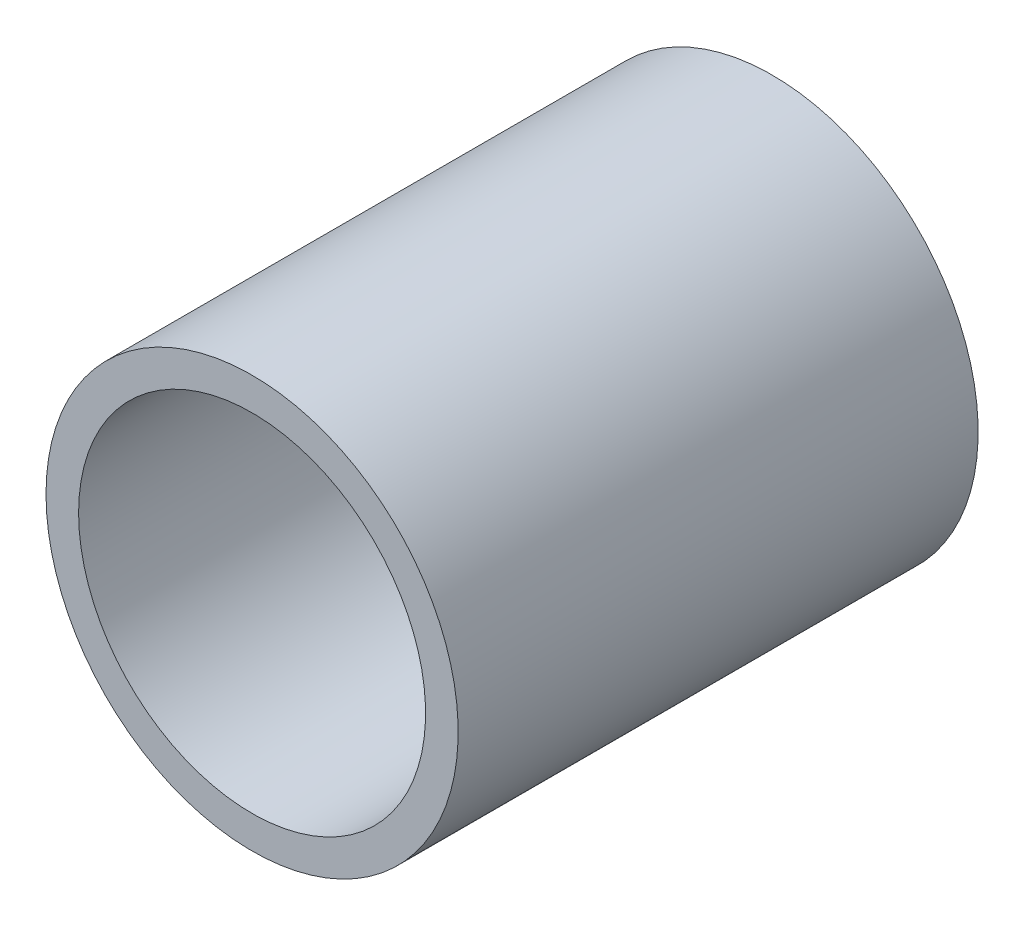
ISO-10303-21;
HEADER;
FILE_DESCRIPTION(('STEP AP214'),'2;1');
FILE_NAME('part.step','',(''),(''),'','','');
FILE_SCHEMA(('AUTOMOTIVE_DESIGN { 1 0 10303 214 1 1 1 1 }'));
ENDSEC;
DATA;
#1=APPLICATION_CONTEXT('core data for automotive mechanical design processes');
#2=APPLICATION_PROTOCOL_DEFINITION('international standard','automotive_design',2000,#1);
#3=PRODUCT_CONTEXT('',#1,'mechanical');
#4=PRODUCT('Part','Part','',(#3));
#5=PRODUCT_RELATED_PRODUCT_CATEGORY('part','',(#4));
#6=PRODUCT_DEFINITION_FORMATION('','',#4);
#7=PRODUCT_DEFINITION_CONTEXT('part definition',#1,'design');
#8=PRODUCT_DEFINITION('design','',#6,#7);
#9=PRODUCT_DEFINITION_SHAPE('','',#8);
#10=(LENGTH_UNIT() NAMED_UNIT(*) SI_UNIT(.MILLI.,.METRE.));
#11=(NAMED_UNIT(*) PLANE_ANGLE_UNIT() SI_UNIT($,.RADIAN.));
#12=(NAMED_UNIT(*) SI_UNIT($,.STERADIAN.) SOLID_ANGLE_UNIT());
#13=UNCERTAINTY_MEASURE_WITH_UNIT(LENGTH_MEASURE(1.E-05),#10,'distance_accuracy_value','');
#14=(GEOMETRIC_REPRESENTATION_CONTEXT(3) GLOBAL_UNCERTAINTY_ASSIGNED_CONTEXT((#13)) GLOBAL_UNIT_ASSIGNED_CONTEXT((#10,
#11,#12)) REPRESENTATION_CONTEXT('',''));
#15=CARTESIAN_POINT('',(0.,0.,0.));
#16=DIRECTION('',(0.,0.,1.));
#17=DIRECTION('',(1.,0.,0.));
#18=AXIS2_PLACEMENT_3D('',#15,#16,#17);
#19=CARTESIAN_POINT('',(15.1003,0.,19.05));
#20=DIRECTION('',(0.,0.,1.));
#21=DIRECTION('',(1.,0.,0.));
#22=AXIS2_PLACEMENT_3D('',#19,#20,#21);
#23=PLANE('',#22);
#24=CARTESIAN_POINT('',(0.,0.,19.05));
#25=DIRECTION('',(0.,0.,-1.));
#26=DIRECTION('',(-1.,0.,0.));
#27=AXIS2_PLACEMENT_3D('',#24,#25,#26);
#28=CIRCLE('',#27,12.7127);
#29=CARTESIAN_POINT('',(-12.7127,0.,19.05));
#30=VERTEX_POINT('',#29);
#31=EDGE_CURVE('E36',#30,#30,#28,.T.);
#32=ORIENTED_EDGE('',*,*,#31,.T.);
#33=EDGE_LOOP('',(#32));
#34=FACE_BOUND('',#33,.T.);
#35=CARTESIAN_POINT('',(0.,0.,19.05));
#36=DIRECTION('',(0.,0.,-1.));
#37=DIRECTION('',(-1.,0.,0.));
#38=AXIS2_PLACEMENT_3D('',#35,#36,#37);
#39=CIRCLE('',#38,15.1003);
#40=CARTESIAN_POINT('',(-15.1003,0.,19.05));
#41=VERTEX_POINT('',#40);
#42=EDGE_CURVE('E22',#41,#41,#39,.T.);
#43=ORIENTED_EDGE('',*,*,#42,.F.);
#44=EDGE_LOOP('',(#43));
#45=FACE_BOUND('',#44,.T.);
#46=ADVANCED_FACE('F15',(#34,#45),#23,.T.);
#47=CARTESIAN_POINT('',(12.7127,0.,-19.05));
#48=DIRECTION('',(0.,0.,-1.));
#49=DIRECTION('',(0.,-1.,0.));
#50=AXIS2_PLACEMENT_3D('',#47,#48,#49);
#51=PLANE('',#50);
#52=CARTESIAN_POINT('',(0.,0.,-19.05));
#53=DIRECTION('',(0.,0.,-1.));
#54=DIRECTION('',(-1.,0.,0.));
#55=AXIS2_PLACEMENT_3D('',#52,#53,#54);
#56=CIRCLE('',#55,12.7127);
#57=CARTESIAN_POINT('',(-12.7127,0.,-19.05));
#58=VERTEX_POINT('',#57);
#59=EDGE_CURVE('E33',#58,#58,#56,.T.);
#60=ORIENTED_EDGE('',*,*,#59,.F.);
#61=EDGE_LOOP('',(#60));
#62=FACE_BOUND('',#61,.T.);
#63=CARTESIAN_POINT('',(0.,0.,-19.05));
#64=DIRECTION('',(0.,0.,-1.));
#65=DIRECTION('',(-1.,0.,0.));
#66=AXIS2_PLACEMENT_3D('',#63,#64,#65);
#67=CIRCLE('',#66,15.1003);
#68=CARTESIAN_POINT('',(-15.1003,0.,-19.05));
#69=VERTEX_POINT('',#68);
#70=EDGE_CURVE('E10',#69,#69,#67,.T.);
#71=ORIENTED_EDGE('',*,*,#70,.T.);
#72=EDGE_LOOP('',(#71));
#73=FACE_BOUND('',#72,.T.);
#74=ADVANCED_FACE('F59',(#62,#73),#51,.T.);
#75=CARTESIAN_POINT('',(0.,0.,19.05));
#76=DIRECTION('',(0.,0.,-1.));
#77=DIRECTION('',(-1.,0.,0.));
#78=AXIS2_PLACEMENT_3D('',#75,#76,#77);
#79=CYLINDRICAL_SURFACE('',#78,15.1003);
#80=ORIENTED_EDGE('',*,*,#70,.F.);
#81=EDGE_LOOP('',(#80));
#82=FACE_BOUND('',#81,.T.);
#83=ORIENTED_EDGE('',*,*,#42,.T.);
#84=EDGE_LOOP('',(#83));
#85=FACE_BOUND('',#84,.T.);
#86=ADVANCED_FACE('F51',(#82,#85),#79,.T.);
#87=CARTESIAN_POINT('',(0.,0.,19.05));
#88=DIRECTION('',(0.,0.,-1.));
#89=DIRECTION('',(-1.,0.,0.));
#90=AXIS2_PLACEMENT_3D('',#87,#88,#89);
#91=CYLINDRICAL_SURFACE('',#90,12.7127);
#92=ORIENTED_EDGE('',*,*,#59,.T.);
#93=EDGE_LOOP('',(#92));
#94=FACE_BOUND('',#93,.T.);
#95=ORIENTED_EDGE('',*,*,#31,.F.);
#96=EDGE_LOOP('',(#95));
#97=FACE_BOUND('',#96,.T.);
#98=ADVANCED_FACE('F47',(#94,#97),#91,.F.);
#99=CLOSED_SHELL('',(#46,#74,#86,#98));
#100=MANIFOLD_SOLID_BREP('B1',#99);
#101=ADVANCED_BREP_SHAPE_REPRESENTATION('',(#18,#100),#14);
#102=SHAPE_DEFINITION_REPRESENTATION(#9,#101);
ENDSEC;
END-ISO-10303-21;
